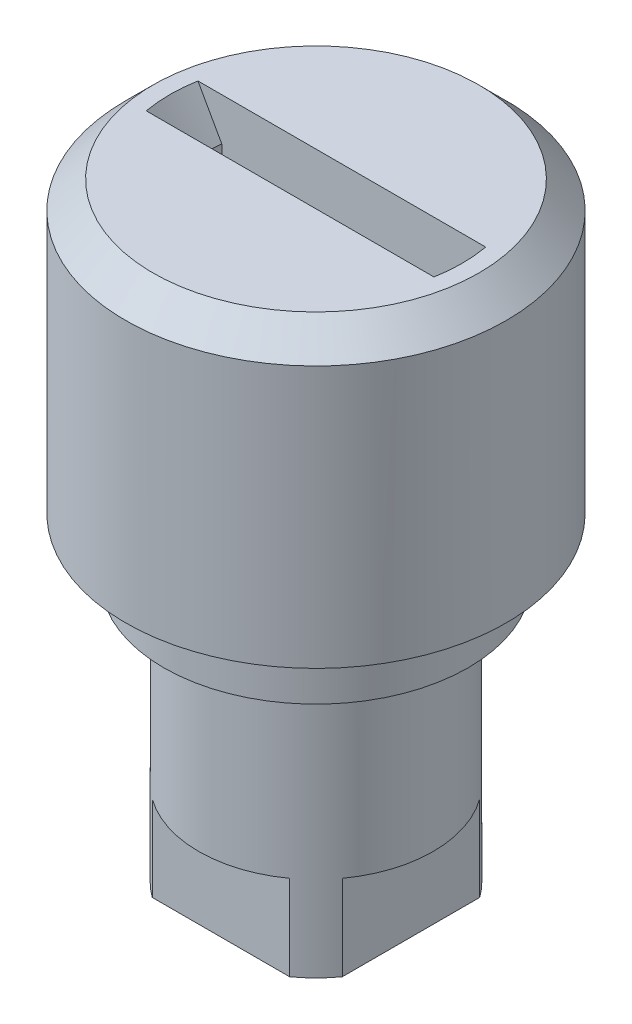
ISO-10303-21;
HEADER;
FILE_DESCRIPTION(('STEP AP214'),'2;1');
FILE_NAME('part.step','',(''),(''),'','','');
FILE_SCHEMA(('AUTOMOTIVE_DESIGN { 1 0 10303 214 1 1 1 1 }'));
ENDSEC;
DATA;
#1=APPLICATION_CONTEXT('core data for automotive mechanical design processes');
#2=APPLICATION_PROTOCOL_DEFINITION('international standard','automotive_design',2000,#1);
#3=PRODUCT_CONTEXT('',#1,'mechanical');
#4=PRODUCT('Part','Part','',(#3));
#5=PRODUCT_RELATED_PRODUCT_CATEGORY('part','',(#4));
#6=PRODUCT_DEFINITION_FORMATION('','',#4);
#7=PRODUCT_DEFINITION_CONTEXT('part definition',#1,'design');
#8=PRODUCT_DEFINITION('design','',#6,#7);
#9=PRODUCT_DEFINITION_SHAPE('','',#8);
#10=(LENGTH_UNIT() NAMED_UNIT(*) SI_UNIT(.MILLI.,.METRE.));
#11=(NAMED_UNIT(*) PLANE_ANGLE_UNIT() SI_UNIT($,.RADIAN.));
#12=(NAMED_UNIT(*) SI_UNIT($,.STERADIAN.) SOLID_ANGLE_UNIT());
#13=UNCERTAINTY_MEASURE_WITH_UNIT(LENGTH_MEASURE(1.E-05),#10,'distance_accuracy_value','');
#14=(GEOMETRIC_REPRESENTATION_CONTEXT(3) GLOBAL_UNCERTAINTY_ASSIGNED_CONTEXT((#13)) GLOBAL_UNIT_ASSIGNED_CONTEXT((#10,
#11,#12)) REPRESENTATION_CONTEXT('',''));
#15=CARTESIAN_POINT('',(0.,0.,0.));
#16=DIRECTION('',(0.,0.,1.));
#17=DIRECTION('',(1.,0.,0.));
#18=AXIS2_PLACEMENT_3D('',#15,#16,#17);
#19=CARTESIAN_POINT('',(18.2637504562743,-1.72021774716313,2.36572914036337E-13));
#20=DIRECTION('',(0.,-1.,0.));
#21=DIRECTION('',(1.,0.,0.));
#22=AXIS2_PLACEMENT_3D('',#19,#20,#21);
#23=CONICAL_SURFACE('',#22,2.50000000005481,1.02974425865528);
#24=CARTESIAN_POINT('',(18.2637504562743,-0.218066199551004,-2.81851365163677E-11));
#25=VERTEX_POINT('',#24);
#26=VERTEX_LOOP('',#25);
#27=FACE_BOUND('',#26,.T.);
#28=CARTESIAN_POINT('',(18.2637504562743,-1.72021774715201,2.36572914036337E-13));
#29=DIRECTION('',(0.,-1.,0.));
#30=DIRECTION('',(0.,0.,-1.));
#31=AXIS2_PLACEMENT_3D('',#28,#29,#30);
#32=CIRCLE('',#31,2.5);
#33=CARTESIAN_POINT('',(18.2637504562743,-1.72021774715201,-2.49999999999976));
#34=VERTEX_POINT('',#33);
#35=EDGE_CURVE('E166',#34,#34,#32,.T.);
#36=ORIENTED_EDGE('',*,*,#35,.T.);
#37=EDGE_LOOP('',(#36));
#38=FACE_BOUND('',#37,.T.);
#39=ADVANCED_FACE('F17',(#27,#38),#23,.F.);
#40=CARTESIAN_POINT('',(18.2637504562743,-14.674217747152,2.36572914036337E-13));
#41=DIRECTION('',(0.,-1.,0.));
#42=DIRECTION('',(0.,0.,-1.));
#43=AXIS2_PLACEMENT_3D('',#40,#41,#42);
#44=CYLINDRICAL_SURFACE('',#43,2.5);
#45=CARTESIAN_POINT('',(18.2637504562743,-14.674217747152,2.36572914036337E-13));
#46=DIRECTION('',(0.,-1.,0.));
#47=DIRECTION('',(0.,0.,-1.));
#48=AXIS2_PLACEMENT_3D('',#45,#46,#47);
#49=CIRCLE('',#48,2.5);
#50=CARTESIAN_POINT('',(18.2637504562743,-14.674217747152,-2.49999999999976));
#51=VERTEX_POINT('',#50);
#52=EDGE_CURVE('E24',#51,#51,#49,.F.);
#53=ORIENTED_EDGE('',*,*,#52,.F.);
#54=EDGE_LOOP('',(#53));
#55=FACE_BOUND('',#54,.T.);
#56=ORIENTED_EDGE('',*,*,#35,.F.);
#57=EDGE_LOOP('',(#56));
#58=FACE_BOUND('',#57,.T.);
#59=ADVANCED_FACE('F416',(#55,#58),#44,.F.);
#60=CARTESIAN_POINT('',(23.642200456274,-14.674217747152,-5.37845));
#61=DIRECTION('',(0.,-1.,0.));
#62=DIRECTION('',(0.,0.,-1.));
#63=AXIS2_PLACEMENT_3D('',#60,#61,#62);
#64=PLANE('',#63);
#65=CARTESIAN_POINT('',(18.2637504562743,-14.674217747152,2.36509868338826E-13));
#66=DIRECTION('',(0.,1.,0.));
#67=DIRECTION('',(0.,0.,1.));
#68=AXIS2_PLACEMENT_3D('',#65,#66,#67);
#69=CIRCLE('',#68,4.88949999999996);
#70=CARTESIAN_POINT('',(14.3013504562743,-14.674217747152,-2.86471577822272));
#71=VERTEX_POINT('',#70);
#72=CARTESIAN_POINT('',(15.3990346780512,-14.674217747152,-3.96239999999972));
#73=VERTEX_POINT('',#72);
#74=EDGE_CURVE('E158',#71,#73,#69,.F.);
#75=ORIENTED_EDGE('',*,*,#74,.T.);
#76=DIRECTION('',(-1.,0.,0.));
#77=VECTOR('',#76,1.);
#78=CARTESIAN_POINT('',(22.2261504562743,-14.674217747152,-3.96239999999976));
#79=LINE('',#78,#77);
#80=CARTESIAN_POINT('',(21.1284662344972,-14.674217747152,-3.96239999999976));
#81=VERTEX_POINT('',#80);
#82=EDGE_CURVE('E133',#81,#73,#79,.T.);
#83=ORIENTED_EDGE('',*,*,#82,.F.);
#84=CARTESIAN_POINT('',(18.2637504562743,-14.6742177471519,2.36509868338825E-13));
#85=DIRECTION('',(0.,1.,0.));
#86=DIRECTION('',(0.,0.,1.));
#87=AXIS2_PLACEMENT_3D('',#84,#85,#86);
#88=CIRCLE('',#87,4.88949999999996);
#89=CARTESIAN_POINT('',(22.2261504562742,-14.674217747152,-2.86471577822277));
#90=VERTEX_POINT('',#89);
#91=EDGE_CURVE('E123',#81,#90,#88,.F.);
#92=ORIENTED_EDGE('',*,*,#91,.T.);
#93=DIRECTION('',(0.,0.,-1.));
#94=VECTOR('',#93,1.);
#95=CARTESIAN_POINT('',(22.2261504562743,-14.674217747152,-3.96239999999976));
#96=LINE('',#95,#94);
#97=CARTESIAN_POINT('',(22.2261504562743,-14.6742177471521,2.86471577822321));
#98=VERTEX_POINT('',#97);
#99=EDGE_CURVE('E130',#98,#90,#96,.T.);
#100=ORIENTED_EDGE('',*,*,#99,.F.);
#101=CARTESIAN_POINT('',(18.2637504562743,-14.6742177471521,2.36509868338829E-13));
#102=DIRECTION('',(0.,1.,0.));
#103=DIRECTION('',(0.,0.,1.));
#104=AXIS2_PLACEMENT_3D('',#101,#102,#103);
#105=CIRCLE('',#104,4.88949999999996);
#106=CARTESIAN_POINT('',(21.1284662344972,-14.674217747152,3.96240000000028));
#107=VERTEX_POINT('',#106);
#108=EDGE_CURVE('E135',#98,#107,#105,.F.);
#109=ORIENTED_EDGE('',*,*,#108,.T.);
#110=DIRECTION('',(1.,0.,0.));
#111=VECTOR('',#110,1.);
#112=CARTESIAN_POINT('',(22.2261504562743,-14.674217747152,3.96240000000024));
#113=LINE('',#112,#111);
#114=CARTESIAN_POINT('',(15.3990346780513,-14.674217747152,3.96240000000024));
#115=VERTEX_POINT('',#114);
#116=EDGE_CURVE('E562',#115,#107,#113,.T.);
#117=ORIENTED_EDGE('',*,*,#116,.F.);
#118=CARTESIAN_POINT('',(18.2637504562743,-14.6742177471521,2.36509868338831E-13));
#119=DIRECTION('',(0.,1.,0.));
#120=DIRECTION('',(0.,0.,1.));
#121=AXIS2_PLACEMENT_3D('',#118,#119,#120);
#122=CIRCLE('',#121,4.88949999999996);
#123=CARTESIAN_POINT('',(14.3013504562742,-14.674217747152,2.86471577822316));
#124=VERTEX_POINT('',#123);
#125=EDGE_CURVE('E587',#115,#124,#122,.F.);
#126=ORIENTED_EDGE('',*,*,#125,.T.);
#127=DIRECTION('',(0.,0.,1.));
#128=VECTOR('',#127,1.);
#129=CARTESIAN_POINT('',(14.3013504562743,-14.674217747152,-3.96239999999976));
#130=LINE('',#129,#128);
#131=EDGE_CURVE('E569',#71,#124,#130,.T.);
#132=ORIENTED_EDGE('',*,*,#131,.F.);
#133=EDGE_LOOP('',(#75,#83,#92,#100,#109,#117,#126,#132));
#134=FACE_BOUND('',#133,.T.);
#135=ORIENTED_EDGE('',*,*,#52,.T.);
#136=EDGE_LOOP('',(#135));
#137=FACE_BOUND('',#136,.T.);
#138=ADVANCED_FACE('F128',(#134,#137),#64,.T.);
#139=CARTESIAN_POINT('',(11.596251025796,-11.118217747152,-6.66749943047759));
#140=DIRECTION('',(0.,1.,0.));
#141=DIRECTION('',(0.,0.,1.));
#142=AXIS2_PLACEMENT_3D('',#139,#140,#141);
#143=PLANE('',#142);
#144=DIRECTION('',(0.,0.,-1.));
#145=VECTOR('',#144,1.);
#146=CARTESIAN_POINT('',(22.2261504562743,-11.118217747152,-3.96239999999976));
#147=LINE('',#146,#145);
#148=CARTESIAN_POINT('',(22.2261504562743,-11.1182177471521,-2.86471577822289));
#149=VERTEX_POINT('',#148);
#150=CARTESIAN_POINT('',(22.2261504562743,-11.118217747152,2.86471577822316));
#151=VERTEX_POINT('',#150);
#152=EDGE_CURVE('E144',#149,#151,#147,.F.);
#153=ORIENTED_EDGE('',*,*,#152,.F.);
#154=CARTESIAN_POINT('',(18.2637504562743,-11.118217747152,1.51287658374104E-13));
#155=DIRECTION('',(0.,1.,0.));
#156=DIRECTION('',(0.,0.,1.));
#157=AXIS2_PLACEMENT_3D('',#154,#155,#156);
#158=CIRCLE('',#157,4.88949999999996);
#159=EDGE_CURVE('E149',#151,#149,#158,.T.);
#160=ORIENTED_EDGE('',*,*,#159,.F.);
#161=EDGE_LOOP('',(#153,#160));
#162=FACE_BOUND('',#161,.T.);
#163=ADVANCED_FACE('F399',(#162),#143,.F.);
#164=CARTESIAN_POINT('',(22.2261504562743,2.71137667929429,-3.96239999999976));
#165=DIRECTION('',(1.,0.,0.));
#166=DIRECTION('',(0.,0.,-1.));
#167=AXIS2_PLACEMENT_3D('',#164,#165,#166);
#168=PLANE('',#167);
#169=ORIENTED_EDGE('',*,*,#99,.T.);
#170=DIRECTION('',(0.,1.,0.));
#171=VECTOR('',#170,1.);
#172=CARTESIAN_POINT('',(22.2261504562742,-14.6742177471522,-2.86471577822281));
#173=LINE('',#172,#171);
#174=EDGE_CURVE('E139',#149,#90,#173,.F.);
#175=ORIENTED_EDGE('',*,*,#174,.F.);
#176=ORIENTED_EDGE('',*,*,#152,.T.);
#177=DIRECTION('',(0.,1.,0.));
#178=VECTOR('',#177,1.);
#179=CARTESIAN_POINT('',(22.2261504562743,-14.6742177471521,2.86471577822321));
#180=LINE('',#179,#178);
#181=EDGE_CURVE('E142',#98,#151,#180,.T.);
#182=ORIENTED_EDGE('',*,*,#181,.F.);
#183=EDGE_LOOP('',(#169,#175,#176,#182));
#184=FACE_BOUND('',#183,.T.);
#185=ADVANCED_FACE('F138',(#184),#168,.T.);
#186=CARTESIAN_POINT('',(11.596251025796,-11.118217747152,-6.66749943047759));
#187=DIRECTION('',(0.,1.,0.));
#188=DIRECTION('',(0.,0.,1.));
#189=AXIS2_PLACEMENT_3D('',#186,#187,#188);
#190=PLANE('',#189);
#191=DIRECTION('',(-1.,0.,0.));
#192=VECTOR('',#191,1.);
#193=CARTESIAN_POINT('',(22.2261504562743,-11.118217747152,-3.96239999999976));
#194=LINE('',#193,#192);
#195=CARTESIAN_POINT('',(15.3990346780512,-11.118217747152,-3.96239999999976));
#196=VERTEX_POINT('',#195);
#197=CARTESIAN_POINT('',(21.1284662344973,-11.118217747152,-3.96239999999981));
#198=VERTEX_POINT('',#197);
#199=EDGE_CURVE('E143',#196,#198,#194,.F.);
#200=ORIENTED_EDGE('',*,*,#199,.F.);
#201=CARTESIAN_POINT('',(18.2637504562743,-11.1182177471519,1.512876583741E-13));
#202=DIRECTION('',(0.,1.,0.));
#203=DIRECTION('',(0.,0.,1.));
#204=AXIS2_PLACEMENT_3D('',#201,#202,#203);
#205=CIRCLE('',#204,4.88949999999996);
#206=EDGE_CURVE('E152',#198,#196,#205,.T.);
#207=ORIENTED_EDGE('',*,*,#206,.F.);
#208=EDGE_LOOP('',(#200,#207));
#209=FACE_BOUND('',#208,.T.);
#210=ADVANCED_FACE('F382',(#209),#190,.F.);
#211=CARTESIAN_POINT('',(22.2261504562743,2.71137667929429,-3.96239999999976));
#212=DIRECTION('',(0.,0.,-1.));
#213=DIRECTION('',(-1.,0.,0.));
#214=AXIS2_PLACEMENT_3D('',#211,#212,#213);
#215=PLANE('',#214);
#216=ORIENTED_EDGE('',*,*,#82,.T.);
#217=DIRECTION('',(0.,1.,0.));
#218=VECTOR('',#217,1.);
#219=CARTESIAN_POINT('',(15.3990346780512,-14.6742177471521,-3.96239999999968));
#220=LINE('',#219,#218);
#221=EDGE_CURVE('E574',#196,#73,#220,.F.);
#222=ORIENTED_EDGE('',*,*,#221,.F.);
#223=ORIENTED_EDGE('',*,*,#199,.T.);
#224=DIRECTION('',(0.,1.,0.));
#225=VECTOR('',#224,1.);
#226=CARTESIAN_POINT('',(21.1284662344972,-14.6742177471522,-3.96239999999976));
#227=LINE('',#226,#225);
#228=EDGE_CURVE('E150',#81,#198,#227,.T.);
#229=ORIENTED_EDGE('',*,*,#228,.F.);
#230=EDGE_LOOP('',(#216,#222,#223,#229));
#231=FACE_BOUND('',#230,.T.);
#232=ADVANCED_FACE('F373',(#231),#215,.T.);
#233=CARTESIAN_POINT('',(11.596251025796,-11.118217747152,-6.66749943047759));
#234=DIRECTION('',(0.,1.,0.));
#235=DIRECTION('',(0.,0.,1.));
#236=AXIS2_PLACEMENT_3D('',#233,#234,#235);
#237=PLANE('',#236);
#238=DIRECTION('',(0.,0.,1.));
#239=VECTOR('',#238,1.);
#240=CARTESIAN_POINT('',(14.3013504562743,-11.118217747152,-3.96239999999976));
#241=LINE('',#240,#239);
#242=CARTESIAN_POINT('',(14.3013504562743,-11.1182177471519,2.86471577822304));
#243=VERTEX_POINT('',#242);
#244=CARTESIAN_POINT('',(14.3013504562743,-11.118217747152,-2.86471577822278));
#245=VERTEX_POINT('',#244);
#246=EDGE_CURVE('E165',#243,#245,#241,.F.);
#247=ORIENTED_EDGE('',*,*,#246,.F.);
#248=CARTESIAN_POINT('',(18.2637504562743,-11.118217747152,1.51287658374103E-13));
#249=DIRECTION('',(0.,1.,0.));
#250=DIRECTION('',(0.,0.,1.));
#251=AXIS2_PLACEMENT_3D('',#248,#249,#250);
#252=CIRCLE('',#251,4.88949999999996);
#253=EDGE_CURVE('E573',#245,#243,#252,.T.);
#254=ORIENTED_EDGE('',*,*,#253,.F.);
#255=EDGE_LOOP('',(#247,#254));
#256=FACE_BOUND('',#255,.T.);
#257=ADVANCED_FACE('F364',(#256),#237,.F.);
#258=CARTESIAN_POINT('',(14.3013504562743,2.71137667929429,-3.96239999999976));
#259=DIRECTION('',(-1.,0.,0.));
#260=DIRECTION('',(0.,0.,1.));
#261=AXIS2_PLACEMENT_3D('',#258,#259,#260);
#262=PLANE('',#261);
#263=ORIENTED_EDGE('',*,*,#131,.T.);
#264=DIRECTION('',(0.,1.,0.));
#265=VECTOR('',#264,1.);
#266=CARTESIAN_POINT('',(14.3013504562742,-14.674217747152,2.86471577822313));
#267=LINE('',#266,#265);
#268=EDGE_CURVE('E566',#243,#124,#267,.F.);
#269=ORIENTED_EDGE('',*,*,#268,.F.);
#270=ORIENTED_EDGE('',*,*,#246,.T.);
#271=DIRECTION('',(0.,1.,0.));
#272=VECTOR('',#271,1.);
#273=CARTESIAN_POINT('',(14.3013504562743,-14.6742177471521,-2.86471577822273));
#274=LINE('',#273,#272);
#275=EDGE_CURVE('E570',#71,#245,#274,.T.);
#276=ORIENTED_EDGE('',*,*,#275,.F.);
#277=EDGE_LOOP('',(#263,#269,#270,#276));
#278=FACE_BOUND('',#277,.T.);
#279=ADVANCED_FACE('F355',(#278),#262,.T.);
#280=CARTESIAN_POINT('',(22.2261504562743,2.71137667929429,3.96240000000024));
#281=DIRECTION('',(0.,0.,1.));
#282=DIRECTION('',(1.,0.,0.));
#283=AXIS2_PLACEMENT_3D('',#280,#281,#282);
#284=PLANE('',#283);
#285=ORIENTED_EDGE('',*,*,#116,.T.);
#286=DIRECTION('',(0.,1.,0.));
#287=VECTOR('',#286,1.);
#288=CARTESIAN_POINT('',(21.1284662344971,-14.674217747152,3.96240000000032));
#289=LINE('',#288,#287);
#290=CARTESIAN_POINT('',(21.1284662344972,-11.1182177471521,3.96240000000024));
#291=VERTEX_POINT('',#290);
#292=EDGE_CURVE('E160',#291,#107,#289,.F.);
#293=ORIENTED_EDGE('',*,*,#292,.F.);
#294=DIRECTION('',(1.,0.,0.));
#295=VECTOR('',#294,1.);
#296=CARTESIAN_POINT('',(11.596251025796,-11.118217747152,3.96240000000024));
#297=LINE('',#296,#295);
#298=CARTESIAN_POINT('',(15.3990346780514,-11.118217747152,3.96240000000019));
#299=VERTEX_POINT('',#298);
#300=EDGE_CURVE('E162',#291,#299,#297,.F.);
#301=ORIENTED_EDGE('',*,*,#300,.T.);
#302=DIRECTION('',(0.,1.,0.));
#303=VECTOR('',#302,1.);
#304=CARTESIAN_POINT('',(15.3990346780513,-14.6742177471519,3.96240000000023));
#305=LINE('',#304,#303);
#306=EDGE_CURVE('E563',#115,#299,#305,.T.);
#307=ORIENTED_EDGE('',*,*,#306,.F.);
#308=EDGE_LOOP('',(#285,#293,#301,#307));
#309=FACE_BOUND('',#308,.T.);
#310=ADVANCED_FACE('F346',(#309),#284,.T.);
#311=CARTESIAN_POINT('',(11.596251025796,-11.118217747152,-6.66749943047759));
#312=DIRECTION('',(0.,1.,0.));
#313=DIRECTION('',(0.,0.,1.));
#314=AXIS2_PLACEMENT_3D('',#311,#312,#313);
#315=PLANE('',#314);
#316=ORIENTED_EDGE('',*,*,#300,.F.);
#317=CARTESIAN_POINT('',(18.2637504562743,-11.1182177471521,1.51287658374107E-13));
#318=DIRECTION('',(0.,1.,0.));
#319=DIRECTION('',(0.,0.,1.));
#320=AXIS2_PLACEMENT_3D('',#317,#318,#319);
#321=CIRCLE('',#320,4.88949999999996);
#322=EDGE_CURVE('E488',#299,#291,#321,.T.);
#323=ORIENTED_EDGE('',*,*,#322,.F.);
#324=EDGE_LOOP('',(#316,#323));
#325=FACE_BOUND('',#324,.T.);
#326=ADVANCED_FACE('F338',(#325),#315,.F.);
#327=CARTESIAN_POINT('',(18.2637504562743,-14.6742177471521,2.36509868338829E-13));
#328=DIRECTION('',(0.,1.,0.));
#329=DIRECTION('',(0.,0.,1.));
#330=AXIS2_PLACEMENT_3D('',#327,#328,#329);
#331=CYLINDRICAL_SURFACE('',#330,4.88949999999996);
#332=ORIENTED_EDGE('',*,*,#228,.T.);
#333=ORIENTED_EDGE('',*,*,#206,.T.);
#334=ORIENTED_EDGE('',*,*,#221,.T.);
#335=ORIENTED_EDGE('',*,*,#74,.F.);
#336=ORIENTED_EDGE('',*,*,#275,.T.);
#337=ORIENTED_EDGE('',*,*,#253,.T.);
#338=ORIENTED_EDGE('',*,*,#268,.T.);
#339=ORIENTED_EDGE('',*,*,#125,.F.);
#340=ORIENTED_EDGE('',*,*,#306,.T.);
#341=ORIENTED_EDGE('',*,*,#322,.T.);
#342=ORIENTED_EDGE('',*,*,#292,.T.);
#343=ORIENTED_EDGE('',*,*,#108,.F.);
#344=ORIENTED_EDGE('',*,*,#181,.T.);
#345=ORIENTED_EDGE('',*,*,#159,.T.);
#346=ORIENTED_EDGE('',*,*,#174,.T.);
#347=ORIENTED_EDGE('',*,*,#91,.F.);
#348=EDGE_LOOP('',(#332,#333,#334,#335,#336,#337,#338,#339,#340,#341,#342,#343,#344,#345,#346,#347));
#349=FACE_BOUND('',#348,.T.);
#350=CARTESIAN_POINT('',(18.2637504562744,-3.75221774715198,0.));
#351=DIRECTION('',(0.,1.,0.));
#352=DIRECTION('',(0.,0.,1.));
#353=AXIS2_PLACEMENT_3D('',#350,#351,#352);
#354=CIRCLE('',#353,4.88949999999996);
#355=CARTESIAN_POINT('',(18.2637504562744,-3.75221774715186,4.88949999999994));
#356=VERTEX_POINT('',#355);
#357=EDGE_CURVE('E558',#356,#356,#354,.T.);
#358=ORIENTED_EDGE('',*,*,#357,.F.);
#359=EDGE_LOOP('',(#358));
#360=FACE_BOUND('',#359,.T.);
#361=ADVANCED_FACE('F146',(#349,#360),#331,.T.);
#362=CARTESIAN_POINT('',(12.945174863059,6.91578225284809,1.13347487058489));
#363=DIRECTION('',(0.,-1.,0.));
#364=DIRECTION('',(0.,0.,-1.));
#365=AXIS2_PLACEMENT_3D('',#362,#363,#364);
#366=PLANE('',#365);
#367=CARTESIAN_POINT('',(23.270011755494,6.91578225284809,1.0795));
#368=CARTESIAN_POINT('',(23.2909279482449,6.91578225284809,0.90152196574641));
#369=CARTESIAN_POINT('',(23.3056328236837,6.91578225284809,0.722940885032535));
#370=CARTESIAN_POINT('',(23.3246411722962,6.91578225284809,0.365208845410863));
#371=CARTESIAN_POINT('',(23.3289448041136,6.91578225284809,0.186057895236653));
#372=CARTESIAN_POINT('',(23.3291161610719,6.91578225284809,-0.0836469131502442));
#373=CARTESIAN_POINT('',(23.3281021666593,6.91578225284809,-0.174223422129514));
#374=CARTESIAN_POINT('',(23.3236843310251,6.91578225284809,-0.355313188408636));
#375=CARTESIAN_POINT('',(23.3202808051301,6.91578225284809,-0.445826452477023));
#376=CARTESIAN_POINT('',(23.3108049929909,6.91578225284809,-0.627010457084635));
#377=CARTESIAN_POINT('',(23.3047240761599,6.91578225284809,-0.717680754504319));
#378=CARTESIAN_POINT('',(23.2896317873898,6.91578225284809,-0.898793078278922));
#379=CARTESIAN_POINT('',(23.2806198574495,6.91578225284809,-0.989235057860429));
#380=CARTESIAN_POINT('',(23.270013608233,6.91578225284809,-1.0795));
#381=B_SPLINE_CURVE_WITH_KNOTS('',3,(#367,#368,#369,#370,#371,#372,#373,#374,#375,#376,#377,
#378,#379,#380),.UNSPECIFIED.,.F.,.F.,(4,2,2,2,2,2,4),(0.,0.537324696747902,1.07464119797423,
1.34637129496316,1.61806554072275,1.89064208091025,2.16327054415478),.UNSPECIFIED.);
#382=CARTESIAN_POINT('',(23.270011755494,6.91578225284809,1.0795));
#383=VERTEX_POINT('',#382);
#384=CARTESIAN_POINT('',(23.270013608233,6.91578225284809,-1.0795));
#385=VERTEX_POINT('',#384);
#386=EDGE_CURVE('E480',#383,#385,#381,.T.);
#387=ORIENTED_EDGE('',*,*,#386,.T.);
#388=DIRECTION('',(-1.,0.,0.));
#389=VECTOR('',#388,1.);
#390=CARTESIAN_POINT('',(12.164092486856,6.91578225284809,-1.0795));
#391=LINE('',#390,#389);
#392=CARTESIAN_POINT('',(13.257489157053,6.91578225284809,-1.0795));
#393=VERTEX_POINT('',#392);
#394=EDGE_CURVE('E554',#385,#393,#391,.T.);
#395=ORIENTED_EDGE('',*,*,#394,.T.);
#396=CARTESIAN_POINT('',(13.257489157053,6.91578225284809,-1.0795));
#397=CARTESIAN_POINT('',(13.2365729643021,6.91578225284809,-0.901521965746409));
#398=CARTESIAN_POINT('',(13.2218680888633,6.91578225284809,-0.722940885032534));
#399=CARTESIAN_POINT('',(13.2028597402507,6.91578225284809,-0.365208845410862));
#400=CARTESIAN_POINT('',(13.1985561084334,6.91578225284809,-0.186057895236653));
#401=CARTESIAN_POINT('',(13.1983847514751,6.91578225284809,0.0836469131502447));
#402=CARTESIAN_POINT('',(13.1993987458877,6.91578225284809,0.174223422129514));
#403=CARTESIAN_POINT('',(13.2038165815219,6.91578225284809,0.355313188408636));
#404=CARTESIAN_POINT('',(13.2072201074169,6.91578225284809,0.445826452477023));
#405=CARTESIAN_POINT('',(13.2166959195561,6.91578225284809,0.627010457084635));
#406=CARTESIAN_POINT('',(13.2227768363871,6.91578225284809,0.71768075450432));
#407=CARTESIAN_POINT('',(13.2378691251572,6.91578225284809,0.898793078278922));
#408=CARTESIAN_POINT('',(13.2468810550974,6.91578225284809,0.989235057860429));
#409=CARTESIAN_POINT('',(13.257487304314,6.91578225284809,1.0795));
#410=B_SPLINE_CURVE_WITH_KNOTS('',3,(#396,#397,#398,#399,#400,#401,#402,#403,#404,#405,#406,
#407,#408,#409),.UNSPECIFIED.,.F.,.F.,(4,2,2,2,2,2,4),(0.,0.537324696747904,1.07464119797423,
1.34637129496316,1.61806554072275,1.89064208091025,2.16327054415478),.UNSPECIFIED.);
#411=CARTESIAN_POINT('',(13.257487304314,6.91578225284809,1.0795));
#412=VERTEX_POINT('',#411);
#413=EDGE_CURVE('E487',#393,#412,#410,.T.);
#414=ORIENTED_EDGE('',*,*,#413,.T.);
#415=DIRECTION('',(1.,0.,0.));
#416=VECTOR('',#415,1.);
#417=CARTESIAN_POINT('',(24.363408425691,6.91578225284809,1.0795));
#418=LINE('',#417,#416);
#419=EDGE_CURVE('E551',#412,#383,#418,.T.);
#420=ORIENTED_EDGE('',*,*,#419,.T.);
#421=EDGE_LOOP('',(#387,#395,#414,#420));
#422=FACE_BOUND('',#421,.T.);
#423=ADVANCED_FACE('F322',(#422),#366,.F.);
#424=CARTESIAN_POINT('',(23.270013608233,8.94778225284809,-1.0795));
#425=CARTESIAN_POINT('',(23.270013608233,6.91578225284809,-1.0795));
#426=CARTESIAN_POINT('',(23.312095229888,8.94778225284809,-0.721345987350809));
#427=CARTESIAN_POINT('',(23.312095229888,6.91578225284809,-0.721345987350809));
#428=CARTESIAN_POINT('',(23.346026997008,8.94089404493101,-8.8957013094E-06));
#429=CARTESIAN_POINT('',(23.346026997008,6.90889404493101,-8.8957013094E-06));
#430=CARTESIAN_POINT('',(23.312093648715,8.94778225284809,0.721329539803821));
#431=CARTESIAN_POINT('',(23.312093648715,6.91578225284809,0.721329539803821));
#432=CARTESIAN_POINT('',(23.270011755494,8.94778225284809,1.0795));
#433=CARTESIAN_POINT('',(23.270011755494,6.91578225284809,1.0795));
#434=B_SPLINE_SURFACE_WITH_KNOTS('',3,1,((#424,#425),(#426,#427),(#428,#429),(#430,#431),(#432,
#433)),.UNSPECIFIED.,.F.,.F.,.F.,(4,1,4),(2,2),(0.,0.49998856627138,1.),(0.,1.),.UNSPECIFIED.);
#435=DIRECTION('',(0.,1.,0.));
#436=VECTOR('',#435,1.);
#437=CARTESIAN_POINT('',(23.270011755494,10.825782252848,1.0795));
#438=LINE('',#437,#436);
#439=CARTESIAN_POINT('',(23.270011755494,8.94778225284807,1.0795));
#440=VERTEX_POINT('',#439);
#441=EDGE_CURVE('E520',#383,#440,#438,.T.);
#442=CARTESIAN_POINT('',(23.270011755494,8.94778225284806,1.07949999999999));
#443=CARTESIAN_POINT('',(23.2804662201171,8.94778372685297,0.990518887923252));
#444=CARTESIAN_POINT('',(23.2893717612618,8.94737888717321,0.901372168036464));
#445=CARTESIAN_POINT('',(23.3043309941787,8.94613727165358,0.722857559266591));
#446=CARTESIAN_POINT('',(23.3103852081901,8.94530057497002,0.633489713900692));
#447=CARTESIAN_POINT('',(23.3246432297611,8.94271343898356,0.365195268912952));
#448=CARTESIAN_POINT('',(23.3289451765824,8.94088574326441,0.18605305099086));
#449=CARTESIAN_POINT('',(23.3291159750194,8.94081622086115,-0.08364811307113));
#450=CARTESIAN_POINT('',(23.328102043908,8.94124853108089,-0.174226815780611));
#451=CARTESIAN_POINT('',(23.3236842840148,8.9425821919002,-0.355316755279328));
#452=CARTESIAN_POINT('',(23.320280745178,8.94348348559178,-0.445827998920113));
#453=CARTESIAN_POINT('',(23.3108050600855,8.94524045411177,-0.627008772772463));
#454=CARTESIAN_POINT('',(23.3047242883692,8.94609597138388,-0.71767786326767));
#455=CARTESIAN_POINT('',(23.2896321068617,8.94736707598679,-0.898789589276961));
#456=CARTESIAN_POINT('',(23.2806201692229,8.94778258402284,-0.989232181044592));
#457=CARTESIAN_POINT('',(23.270013608233,8.94778225284809,-1.0795));
#458=B_SPLINE_CURVE_WITH_KNOTS('',3,(#442,#443,#444,#445,#446,#447,#448,#449,#450,#451,#452,
#453,#454,#455,#456,#457),.UNSPECIFIED.,.F.,.F.,(4,2,2,2,2,2,2,4),(0.,0.268738973155829,
0.537428705852836,1.07473370121402,1.34646892785018,1.61817118893844,1.89075529518443,
2.1633885158851),.UNSPECIFIED.);
#459=CARTESIAN_POINT('',(23.270013608233,8.94778225284814,-1.0795));
#460=VERTEX_POINT('',#459);
#461=EDGE_CURVE('E472',#440,#460,#458,.T.);
#462=DIRECTION('',(0.,1.,0.));
#463=VECTOR('',#462,1.);
#464=CARTESIAN_POINT('',(23.270013608233,10.825782252848,-1.0795));
#465=LINE('',#464,#463);
#466=EDGE_CURVE('E555',#460,#385,#465,.F.);
#467=ORIENTED_EDGE('',*,*,#441,.T.);
#468=ORIENTED_EDGE('',*,*,#461,.T.);
#469=ORIENTED_EDGE('',*,*,#466,.T.);
#470=ORIENTED_EDGE('',*,*,#386,.F.);
#471=EDGE_LOOP('',(#467,#468,#469,#470));
#472=FACE_BOUND('',#471,.T.);
#473=ADVANCED_FACE('F314',(#472),#434,.F.);
#474=CARTESIAN_POINT('',(13.257487304314,8.94778225284809,1.0795));
#475=CARTESIAN_POINT('',(13.257487304314,6.91578225284809,1.0795));
#476=CARTESIAN_POINT('',(13.215405682659,8.94778225284809,0.721345987350835));
#477=CARTESIAN_POINT('',(13.215405682659,6.91578225284809,0.721345987350835));
#478=CARTESIAN_POINT('',(13.181473915539,8.94089404493101,8.8957013094E-06));
#479=CARTESIAN_POINT('',(13.181473915539,6.90889404493101,8.8957013094E-06));
#480=CARTESIAN_POINT('',(13.215407263832,8.94778225284809,-0.721329539803796));
#481=CARTESIAN_POINT('',(13.215407263832,6.91578225284809,-0.721329539803796));
#482=CARTESIAN_POINT('',(13.257489157053,8.94778225284809,-1.0795));
#483=CARTESIAN_POINT('',(13.257489157053,6.91578225284809,-1.0795));
#484=B_SPLINE_SURFACE_WITH_KNOTS('',3,1,((#474,#475),(#476,#477),(#478,#479),(#480,#481),(#482,
#483)),.UNSPECIFIED.,.F.,.F.,.F.,(4,1,4),(2,2),(0.,0.49998856627136,1.),(0.,1.),.UNSPECIFIED.);
#485=DIRECTION('',(0.,1.,0.));
#486=VECTOR('',#485,1.);
#487=CARTESIAN_POINT('',(13.257489157053,10.825782252848,-1.0795));
#488=LINE('',#487,#486);
#489=CARTESIAN_POINT('',(13.2574891570532,8.94778225284817,-1.0795));
#490=VERTEX_POINT('',#489);
#491=EDGE_CURVE('E540',#393,#490,#488,.T.);
#492=CARTESIAN_POINT('',(13.2574891570531,8.94778225284814,-1.07949999999998));
#493=CARTESIAN_POINT('',(13.24703469243,8.94778372685349,-0.990518887923243));
#494=CARTESIAN_POINT('',(13.2381291512853,8.94737888717389,-0.901372168036459));
#495=CARTESIAN_POINT('',(13.2231699183683,8.9461372716543,-0.722857559266587));
#496=CARTESIAN_POINT('',(13.2171157043569,8.94530057497063,-0.633489713900689));
#497=CARTESIAN_POINT('',(13.202857682786,8.94271343898396,-0.365195268912951));
#498=CARTESIAN_POINT('',(13.1985557359646,8.94088574326479,-0.186053050990861));
#499=CARTESIAN_POINT('',(13.1983849375276,8.94081622086149,0.0836481130711275));
#500=CARTESIAN_POINT('',(13.1993988686389,8.94124853108122,0.174226815780609));
#501=CARTESIAN_POINT('',(13.2038166285322,8.94258219190049,0.355316755279325));
#502=CARTESIAN_POINT('',(13.2072201673689,8.94348348559205,0.445827998920109));
#503=CARTESIAN_POINT('',(13.2166958524615,8.94524045411204,0.62700877277246));
#504=CARTESIAN_POINT('',(13.2227766241778,8.94609597138417,0.717677863267666));
#505=CARTESIAN_POINT('',(13.2378688056852,8.94736707598704,0.898789589276959));
#506=CARTESIAN_POINT('',(13.2468807433241,8.94778258402302,0.989232181044591));
#507=CARTESIAN_POINT('',(13.257487304314,8.94778225284809,1.0795));
#508=B_SPLINE_CURVE_WITH_KNOTS('',3,(#492,#493,#494,#495,#496,#497,#498,#499,#500,#501,#502,
#503,#504,#505,#506,#507),.UNSPECIFIED.,.F.,.F.,(4,2,2,2,2,2,2,4),(0.,0.268738973155832,
0.537428705852838,1.07473370121402,1.34646892785017,1.61817118893844,1.89075529518443,
2.1633885158851),.UNSPECIFIED.);
#509=CARTESIAN_POINT('',(13.257487304314,8.94778225284824,1.0795));
#510=VERTEX_POINT('',#509);
#511=EDGE_CURVE('E529',#490,#510,#508,.T.);
#512=DIRECTION('',(0.,1.,0.));
#513=VECTOR('',#512,1.);
#514=CARTESIAN_POINT('',(13.257487304314,10.825782252848,1.0795));
#515=LINE('',#514,#513);
#516=EDGE_CURVE('E514',#510,#412,#515,.F.);
#517=ORIENTED_EDGE('',*,*,#491,.T.);
#518=ORIENTED_EDGE('',*,*,#511,.T.);
#519=ORIENTED_EDGE('',*,*,#516,.T.);
#520=ORIENTED_EDGE('',*,*,#413,.F.);
#521=EDGE_LOOP('',(#517,#518,#519,#520));
#522=FACE_BOUND('',#521,.T.);
#523=ADVANCED_FACE('F19',(#522),#484,.F.);
#524=CARTESIAN_POINT('',(25.248750456274,-3.75221774715191,-6.985));
#525=DIRECTION('',(0.,-1.,0.));
#526=DIRECTION('',(0.,0.,-1.));
#527=AXIS2_PLACEMENT_3D('',#524,#525,#526);
#528=PLANE('',#527);
#529=CARTESIAN_POINT('',(18.2637504562743,-3.75221774715194,2.36509868338826E-13));
#530=DIRECTION('',(0.,1.,0.));
#531=DIRECTION('',(0.,0.,1.));
#532=AXIS2_PLACEMENT_3D('',#529,#530,#531);
#533=CIRCLE('',#532,6.34999999999998);
#534=CARTESIAN_POINT('',(18.2637504562743,-3.75221774715189,6.35000000000021));
#535=VERTEX_POINT('',#534);
#536=EDGE_CURVE('E528',#535,#535,#533,.T.);
#537=ORIENTED_EDGE('',*,*,#536,.F.);
#538=EDGE_LOOP('',(#537));
#539=FACE_BOUND('',#538,.T.);
#540=ORIENTED_EDGE('',*,*,#357,.T.);
#541=EDGE_LOOP('',(#540));
#542=FACE_BOUND('',#541,.T.);
#543=ADVANCED_FACE('F297',(#539,#542),#528,.T.);
#544=CARTESIAN_POINT('',(12.164092486856,10.825782252848,-1.0795));
#545=DIRECTION('',(0.,0.,-1.));
#546=DIRECTION('',(-1.,0.,0.));
#547=AXIS2_PLACEMENT_3D('',#544,#545,#546);
#548=PLANE('',#547);
#549=CARTESIAN_POINT('',(12.264092486856,10.725782252848,-1.0795));
#550=CARTESIAN_POINT('',(12.3091182926636,10.6437164563116,-1.0795));
#551=CARTESIAN_POINT('',(12.3542800405563,10.5617254655259,-1.0795));
#552=CARTESIAN_POINT('',(12.4448249355505,10.3978661379231,-1.0795));
#553=CARTESIAN_POINT('',(12.4902080819408,10.3159978007131,-1.0795));
#554=CARTESIAN_POINT('',(12.6266141525198,10.0705358580353,-1.0795));
#555=CARTESIAN_POINT('',(12.7178938813651,9.90708500666306,-1.0795));
#556=CARTESIAN_POINT('',(12.8838230205886,9.61095231494081,-1.0795));
#557=CARTESIAN_POINT('',(12.9583938107841,9.47822636322439,-1.0795));
#558=CARTESIAN_POINT('',(13.1077767339969,9.21291105454894,-1.0795));
#559=CARTESIAN_POINT('',(13.1825888659971,9.08032169701737,-1.0795));
#560=CARTESIAN_POINT('',(13.2574891570532,8.94778225284822,-1.0795));
#561=B_SPLINE_CURVE_WITH_KNOTS('',3,(#549,#550,#551,#552,#553,#554,#555,#556,#557,#558,#559,
#560),.UNSPECIFIED.,.F.,.F.,(4,2,2,2,2,4),(0.,0.280818144794494,0.561635388096063,
1.12326879658744,1.57998821945748,2.03670572013656),.UNSPECIFIED.);
#562=CARTESIAN_POINT('',(12.264092486856,10.725782252848,-1.0795));
#563=VERTEX_POINT('',#562);
#564=EDGE_CURVE('E502',#563,#490,#561,.T.);
#565=ORIENTED_EDGE('',*,*,#564,.T.);
#566=ORIENTED_EDGE('',*,*,#491,.F.);
#567=ORIENTED_EDGE('',*,*,#394,.F.);
#568=ORIENTED_EDGE('',*,*,#466,.F.);
#569=CARTESIAN_POINT('',(23.270013608233,8.94778225284814,-1.0795));
#570=CARTESIAN_POINT('',(23.3621148979236,9.11077065672441,-1.0795));
#571=CARTESIAN_POINT('',(23.4540897272196,9.27383089803613,-1.0795));
#572=CARTESIAN_POINT('',(23.6376503931516,9.60017019757961,-1.0795));
#573=CARTESIAN_POINT('',(23.7292362296327,9.76344925589853,-1.0795));
#574=CARTESIAN_POINT('',(23.8948233150134,10.059772759197,-1.0795));
#575=CARTESIAN_POINT('',(23.9689134988018,10.1927674426692,-1.0795));
#576=CARTESIAN_POINT('',(24.1165841045405,10.4590402896018,-1.0795));
#577=CARTESIAN_POINT('',(24.1901645238252,10.5923184545399,-1.0795));
#578=CARTESIAN_POINT('',(24.263408425691,10.725782252848,-1.0795));
#579=B_SPLINE_CURVE_WITH_KNOTS('',3,(#569,#570,#571,#572,#573,#574,#575,#576,#577,#578),
.UNSPECIFIED.,.F.,.F.,(4,2,2,2,4),(0.,0.561632691629948,1.12326560707011,1.57998387599166,
2.03670453149725),.UNSPECIFIED.);
#580=CARTESIAN_POINT('',(24.263408425691,10.725782252848,-1.0795));
#581=VERTEX_POINT('',#580);
#582=EDGE_CURVE('E509',#460,#581,#579,.T.);
#583=ORIENTED_EDGE('',*,*,#582,.T.);
#584=DIRECTION('',(1.,0.,0.));
#585=VECTOR('',#584,1.);
#586=CARTESIAN_POINT('',(10.789800456274,10.725782252848,-1.0795));
#587=LINE('',#586,#585);
#588=EDGE_CURVE('E542',#563,#581,#587,.T.);
#589=ORIENTED_EDGE('',*,*,#588,.F.);
#590=EDGE_LOOP('',(#565,#566,#567,#568,#583,#589));
#591=FACE_BOUND('',#590,.T.);
#592=ADVANCED_FACE('F289',(#591),#548,.F.);
#593=CARTESIAN_POINT('',(23.149942211559,8.89324663433621,1.6805276507174));
#594=CARTESIAN_POINT('',(24.263408425691,10.725782252848,1.0795));
#595=CARTESIAN_POINT('',(23.1979221465318,8.84297601150222,1.26058887377406));
#596=CARTESIAN_POINT('',(24.311388360664,10.7257822528478,0.812836545411618));
#597=CARTESIAN_POINT('',(23.2706100298664,8.77460600728873,-5.31214990908E-05));
#598=CARTESIAN_POINT('',(24.3840762439988,10.7257822528479,0.));
#599=CARTESIAN_POINT('',(23.1979221465318,8.84297601150222,-1.26058887377406));
#600=CARTESIAN_POINT('',(24.311388360664,10.7257822528478,-0.812836545411567));
#601=CARTESIAN_POINT('',(23.149942211559,8.89324663433621,-1.6805276507174));
#602=CARTESIAN_POINT('',(24.263408425691,10.725782252848,-1.0795));
#603=(BOUNDED_SURFACE() B_SPLINE_SURFACE(2,1,((#593,#594),(#595,#596),(#597,#598),(#599,#600),
(#601,#602)),.UNSPECIFIED.,.F.,.F.,.F.) B_SPLINE_SURFACE_WITH_KNOTS((3,1,1,3),(2,2),(0.,
0.84577346842464,2.5373204052739,3.3830938736986),(0.,3.465),
.UNSPECIFIED.) GEOMETRIC_REPRESENTATION_ITEM() RATIONAL_B_SPLINE_SURFACE(((1.,1.),
(0.99604896528125,0.99604896528125),(0.99012241320312,0.99012241320312),(0.99604896528125,
0.99604896528125),(1.,1.))) REPRESENTATION_ITEM('') SURFACE());
#604=CARTESIAN_POINT('',(23.2700117554941,8.94778225284806,1.0795));
#605=CARTESIAN_POINT('',(23.3621132917957,9.11077051731189,1.0795));
#606=CARTESIAN_POINT('',(23.4540883506233,9.27383062929162,1.0795));
#607=CARTESIAN_POINT('',(23.6376494129535,9.60016970604742,1.0795));
#608=CARTESIAN_POINT('',(23.729235416301,9.76344867091071,1.0795));
#609=CARTESIAN_POINT('',(23.8948227952113,10.0597721832811,1.0795));
#610=CARTESIAN_POINT('',(23.9689131207633,10.1927669607446,1.0795));
#611=CARTESIAN_POINT('',(24.1165839551751,10.4590400265006,1.0795));
#612=CARTESIAN_POINT('',(24.1901644613681,10.5923183162714,1.0795));
#613=CARTESIAN_POINT('',(24.263408425691,10.725782252848,1.0795));
#614=B_SPLINE_CURVE_WITH_KNOTS('',3,(#604,#605,#606,#607,#608,#609,#610,#611,#612,#613),
.UNSPECIFIED.,.F.,.F.,(4,2,2,2,4),(0.,0.561632691706931,1.12326560730921,1.57998432929902,
2.03670543845817),.UNSPECIFIED.);
#615=CARTESIAN_POINT('',(24.263408425691,10.725782252848,1.0795));
#616=VERTEX_POINT('',#615);
#617=EDGE_CURVE('E515',#440,#616,#614,.T.);
#618=CARTESIAN_POINT('',(24.263408425691,10.725782252848,-1.0795));
#619=CARTESIAN_POINT('',(24.2966326950741,10.7257822528479,-0.894993445022054));
#620=CARTESIAN_POINT('',(24.3212950618956,10.7257822528478,-0.708943068778414));
#621=CARTESIAN_POINT('',(24.3533985861816,10.7257822528478,-0.335361793748878));
#622=CARTESIAN_POINT('',(24.3608397436461,10.7257822528478,-0.147830894962983));
#623=CARTESIAN_POINT('',(24.3584897386219,10.7257822528479,0.213824109803706));
#624=CARTESIAN_POINT('',(24.3498819708628,10.725782252848,0.387956866289378));
#625=CARTESIAN_POINT('',(24.3177931133595,10.725782252848,0.735001366339563));
#626=CARTESIAN_POINT('',(24.2942988957258,10.725782252848,0.907911895830325));
#627=CARTESIAN_POINT('',(24.263408425691,10.725782252848,1.0795));
#628=B_SPLINE_CURVE_WITH_KNOTS('',3,(#618,#619,#620,#621,#622,#623,#624,#625,#626,#627),
.UNSPECIFIED.,.F.,.F.,(4,2,2,2,4),(0.,0.56223055691285,1.12446111382568,1.64686328636869,
2.16972679127631),.UNSPECIFIED.);
#629=EDGE_CURVE('E187',#581,#616,#628,.T.);
#630=ORIENTED_EDGE('',*,*,#582,.F.);
#631=ORIENTED_EDGE('',*,*,#461,.F.);
#632=ORIENTED_EDGE('',*,*,#617,.T.);
#633=ORIENTED_EDGE('',*,*,#629,.F.);
#634=EDGE_LOOP('',(#630,#631,#632,#633));
#635=FACE_BOUND('',#634,.T.);
#636=ADVANCED_FACE('F282',(#635),#603,.F.);
#637=CARTESIAN_POINT('',(24.363408425691,10.825782252848,1.0795));
#638=DIRECTION('',(0.,0.,1.));
#639=DIRECTION('',(1.,0.,0.));
#640=AXIS2_PLACEMENT_3D('',#637,#638,#639);
#641=PLANE('',#640);
#642=ORIENTED_EDGE('',*,*,#617,.F.);
#643=ORIENTED_EDGE('',*,*,#441,.F.);
#644=ORIENTED_EDGE('',*,*,#419,.F.);
#645=ORIENTED_EDGE('',*,*,#516,.F.);
#646=CARTESIAN_POINT('',(13.2574873043141,8.94778225284825,1.0795));
#647=CARTESIAN_POINT('',(13.1653860146232,9.11077065672516,1.07949999999988));
#648=CARTESIAN_POINT('',(13.0734111853268,9.27383089803754,1.07949999999994));
#649=CARTESIAN_POINT('',(12.889850519394,9.60017019758231,1.07950000000006));
#650=CARTESIAN_POINT('',(12.7982646829126,9.76344925590188,1.07950000000012));
#651=CARTESIAN_POINT('',(12.6326775975318,10.0597727592003,1.07949999999991));
#652=CARTESIAN_POINT('',(12.5585874137437,10.1927674426718,1.07949999999969));
#653=CARTESIAN_POINT('',(12.4109168080056,10.459040289603,1.07950000000031));
#654=CARTESIAN_POINT('',(12.3373363887214,10.5923184545405,1.07950000000113));
#655=CARTESIAN_POINT('',(12.264092486856,10.725782252848,1.0795000000031));
#656=B_SPLINE_CURVE_WITH_KNOTS('',3,(#646,#647,#648,#649,#650,#651,#652,#653,#654,#655),
.UNSPECIFIED.,.F.,.F.,(4,2,2,2,4),(0.,0.561632691632166,1.12326560707455,1.57998387599384,
2.03670453149719),.UNSPECIFIED.);
#657=CARTESIAN_POINT('',(12.264092486856,10.725782252848,1.07950000000387));
#658=VERTEX_POINT('',#657);
#659=EDGE_CURVE('E39',#510,#658,#656,.T.);
#660=ORIENTED_EDGE('',*,*,#659,.T.);
#661=DIRECTION('',(1.,0.,0.));
#662=VECTOR('',#661,1.);
#663=CARTESIAN_POINT('',(10.789800456274,10.725782252848,1.0795));
#664=LINE('',#663,#662);
#665=EDGE_CURVE('E186',#616,#658,#664,.F.);
#666=ORIENTED_EDGE('',*,*,#665,.F.);
#667=EDGE_LOOP('',(#642,#643,#644,#645,#660,#666));
#668=FACE_BOUND('',#667,.T.);
#669=ADVANCED_FACE('F215',(#668),#641,.F.);
#670=CARTESIAN_POINT('',(13.377558700992,8.8932466343291,-1.68052765071979));
#671=CARTESIAN_POINT('',(12.264092486856,10.725782252848,-1.0795));
#672=CARTESIAN_POINT('',(13.32957876602,8.84297601149487,-1.26058887377527));
#673=CARTESIAN_POINT('',(12.2161125518838,10.7257822528479,-0.812836545411212));
#674=CARTESIAN_POINT('',(13.2568908826849,8.77460600728121,5.31215016054E-05));
#675=CARTESIAN_POINT('',(12.1434246685483,10.7257822528483,1.556924496E-12));
#676=CARTESIAN_POINT('',(13.32957876602,8.84297601149528,1.26058887378));
#677=CARTESIAN_POINT('',(12.2161125518838,10.7257822528479,0.812836545414285));
#678=CARTESIAN_POINT('',(13.377558700993,8.89324663432971,1.68052765072449));
#679=CARTESIAN_POINT('',(12.264092486856,10.725782252848,1.0795000000031));
#680=(BOUNDED_SURFACE() B_SPLINE_SURFACE(2,1,((#670,#671),(#672,#673),(#674,#675),(#676,#677),
(#678,#679)),.UNSPECIFIED.,.F.,.F.,.F.) B_SPLINE_SURFACE_WITH_KNOTS((3,1,1,3),(2,2),(0.,
0.84577346842259,2.5373204052678,3.3830938736904),(0.,3.465),
.UNSPECIFIED.) GEOMETRIC_REPRESENTATION_ITEM() RATIONAL_B_SPLINE_SURFACE(((1.,1.),
(0.99604896528124,0.99604896528124),(0.99012241320309,0.99012241320309),(0.99604896528124,
0.99604896528124),(1.,1.))) REPRESENTATION_ITEM('') SURFACE());
#681=CARTESIAN_POINT('',(12.264092486856,10.725782252848,1.0795000000031));
#682=CARTESIAN_POINT('',(12.2308682174733,10.7257822528479,0.894993445024377));
#683=CARTESIAN_POINT('',(12.2062058506519,10.7257822528479,0.708943068779976));
#684=CARTESIAN_POINT('',(12.1741023263658,10.7257822528481,0.335361793748937));
#685=CARTESIAN_POINT('',(12.1666611689012,10.7257822528481,0.147830894962299));
#686=CARTESIAN_POINT('',(12.1690111739256,10.7257822528481,-0.213824109804853));
#687=CARTESIAN_POINT('',(12.177618941685,10.725782252848,-0.38795686629025));
#688=CARTESIAN_POINT('',(12.2097077991884,10.7257822528479,-0.735001366339944));
#689=CARTESIAN_POINT('',(12.2332020168219,10.7257822528479,-0.907911895830491));
#690=CARTESIAN_POINT('',(12.264092486856,10.725782252848,-1.0795));
#691=B_SPLINE_CURVE_WITH_KNOTS('',3,(#681,#682,#683,#684,#685,#686,#687,#688,#689,#690),
.UNSPECIFIED.,.F.,.F.,(4,2,2,2,4),(0.,0.56223055691506,1.12446111383012,1.64686328637235,
2.16972679127926),.UNSPECIFIED.);
#692=EDGE_CURVE('E177',#658,#563,#691,.T.);
#693=ORIENTED_EDGE('',*,*,#659,.F.);
#694=ORIENTED_EDGE('',*,*,#511,.F.);
#695=ORIENTED_EDGE('',*,*,#564,.F.);
#696=ORIENTED_EDGE('',*,*,#692,.F.);
#697=EDGE_LOOP('',(#693,#694,#695,#696));
#698=FACE_BOUND('',#697,.T.);
#699=ADVANCED_FACE('F194',(#698),#680,.F.);
#700=CARTESIAN_POINT('',(18.2637504562743,-3.75221774715194,2.36509868338826E-13));
#701=DIRECTION('',(0.,1.,0.));
#702=DIRECTION('',(0.,0.,1.));
#703=AXIS2_PLACEMENT_3D('',#700,#701,#702);
#704=CYLINDRICAL_SURFACE('',#703,6.34999999999998);
#705=ORIENTED_EDGE('',*,*,#536,.T.);
#706=EDGE_LOOP('',(#705));
#707=FACE_BOUND('',#706,.T.);
#708=CARTESIAN_POINT('',(18.2637504562743,-1.33921774715194,2.14245565985542E-13));
#709=DIRECTION('',(0.,1.,0.));
#710=DIRECTION('',(0.,0.,1.));
#711=AXIS2_PLACEMENT_3D('',#708,#709,#710);
#712=CIRCLE('',#711,6.34999999999998);
#713=CARTESIAN_POINT('',(18.2637504562743,-1.33921774715189,6.35000000000019));
#714=VERTEX_POINT('',#713);
#715=EDGE_CURVE('E174',#714,#714,#712,.T.);
#716=ORIENTED_EDGE('',*,*,#715,.F.);
#717=EDGE_LOOP('',(#716));
#718=FACE_BOUND('',#717,.T.);
#719=ADVANCED_FACE('F205',(#707,#718),#704,.T.);
#720=CARTESIAN_POINT('',(10.789800456274,10.725782252848,-7.47395));
#721=DIRECTION('',(0.,1.,0.));
#722=DIRECTION('',(0.,0.,1.));
#723=AXIS2_PLACEMENT_3D('',#720,#721,#722);
#724=PLANE('',#723);
#725=ORIENTED_EDGE('',*,*,#665,.T.);
#726=ORIENTED_EDGE('',*,*,#692,.T.);
#727=ORIENTED_EDGE('',*,*,#588,.T.);
#728=ORIENTED_EDGE('',*,*,#629,.T.);
#729=EDGE_LOOP('',(#725,#726,#727,#728));
#730=FACE_BOUND('',#729,.T.);
#731=CARTESIAN_POINT('',(18.2637504562742,10.725782252873,1.74033246106616E-13));
#732=DIRECTION('',(0.,-1.,0.));
#733=DIRECTION('',(1.,0.,0.));
#734=AXIS2_PLACEMENT_3D('',#731,#732,#733);
#735=CIRCLE('',#734,6.79449999989856);
#736=CARTESIAN_POINT('',(25.0582504561727,10.725782252873,1.74033246106616E-13));
#737=VERTEX_POINT('',#736);
#738=EDGE_CURVE('E171',#737,#737,#735,.T.);
#739=ORIENTED_EDGE('',*,*,#738,.F.);
#740=EDGE_LOOP('',(#739));
#741=FACE_BOUND('',#740,.T.);
#742=ADVANCED_FACE('F200',(#730,#741),#724,.T.);
#743=CARTESIAN_POINT('',(26.995000456274,-1.33921774715191,-8.73125));
#744=DIRECTION('',(0.,-1.,0.));
#745=DIRECTION('',(0.,0.,-1.));
#746=AXIS2_PLACEMENT_3D('',#743,#744,#745);
#747=PLANE('',#746);
#748=ORIENTED_EDGE('',*,*,#715,.T.);
#749=EDGE_LOOP('',(#748));
#750=FACE_BOUND('',#749,.T.);
#751=CARTESIAN_POINT('',(18.2637504562742,-1.33921774715186,2.18589954489279E-13));
#752=DIRECTION('',(0.,1.,0.));
#753=DIRECTION('',(-1.,0.,0.));
#754=AXIS2_PLACEMENT_3D('',#751,#752,#753);
#755=CIRCLE('',#754,7.93749999999999);
#756=CARTESIAN_POINT('',(10.3262504562742,-1.33921774715191,2.18589954489279E-13));
#757=VERTEX_POINT('',#756);
#758=EDGE_CURVE('E30',#757,#757,#755,.T.);
#759=ORIENTED_EDGE('',*,*,#758,.F.);
#760=EDGE_LOOP('',(#759));
#761=FACE_BOUND('',#760,.T.);
#762=ADVANCED_FACE('F204',(#750,#761),#747,.T.);
#763=CARTESIAN_POINT('',(18.2637504562742,9.58278225294857,1.78279849175591E-13));
#764=DIRECTION('',(0.,-1.,0.));
#765=DIRECTION('',(1.,0.,0.));
#766=AXIS2_PLACEMENT_3D('',#763,#764,#765);
#767=CONICAL_SURFACE('',#766,7.93749999987978,0.785398163422308);
#768=CARTESIAN_POINT('',(18.2637504562742,9.58278225284789,1.78279849175962E-13));
#769=DIRECTION('',(0.,1.,0.));
#770=DIRECTION('',(-1.,0.,0.));
#771=AXIS2_PLACEMENT_3D('',#768,#769,#770);
#772=CIRCLE('',#771,7.93749999999999);
#773=CARTESIAN_POINT('',(10.3262504562742,9.58278225284784,1.78279849175962E-13));
#774=VERTEX_POINT('',#773);
#775=EDGE_CURVE('E11',#774,#774,#772,.F.);
#776=ORIENTED_EDGE('',*,*,#775,.F.);
#777=EDGE_LOOP('',(#776));
#778=FACE_BOUND('',#777,.T.);
#779=ORIENTED_EDGE('',*,*,#738,.T.);
#780=EDGE_LOOP('',(#779));
#781=FACE_BOUND('',#780,.T.);
#782=ADVANCED_FACE('F221',(#778,#781),#767,.T.);
#783=CARTESIAN_POINT('',(18.2637504562742,-1.33921774715186,2.18589954489279E-13));
#784=DIRECTION('',(0.,1.,0.));
#785=DIRECTION('',(-1.,0.,0.));
#786=AXIS2_PLACEMENT_3D('',#783,#784,#785);
#787=CYLINDRICAL_SURFACE('',#786,7.93749999999999);
#788=ORIENTED_EDGE('',*,*,#758,.T.);
#789=EDGE_LOOP('',(#788));
#790=FACE_BOUND('',#789,.T.);
#791=ORIENTED_EDGE('',*,*,#775,.T.);
#792=EDGE_LOOP('',(#791));
#793=FACE_BOUND('',#792,.T.);
#794=ADVANCED_FACE('F219',(#790,#793),#787,.T.);
#795=CLOSED_SHELL('',(#39,#59,#138,#163,#185,#210,#232,#257,#279,#310,#326,#361,#423,#473,#523,
#543,#592,#636,#669,#699,#719,#742,#762,#782,#794));
#796=MANIFOLD_SOLID_BREP('B1',#795);
#797=ADVANCED_BREP_SHAPE_REPRESENTATION('',(#18,#796),#14);
#798=SHAPE_DEFINITION_REPRESENTATION(#9,#797);
ENDSEC;
END-ISO-10303-21;
